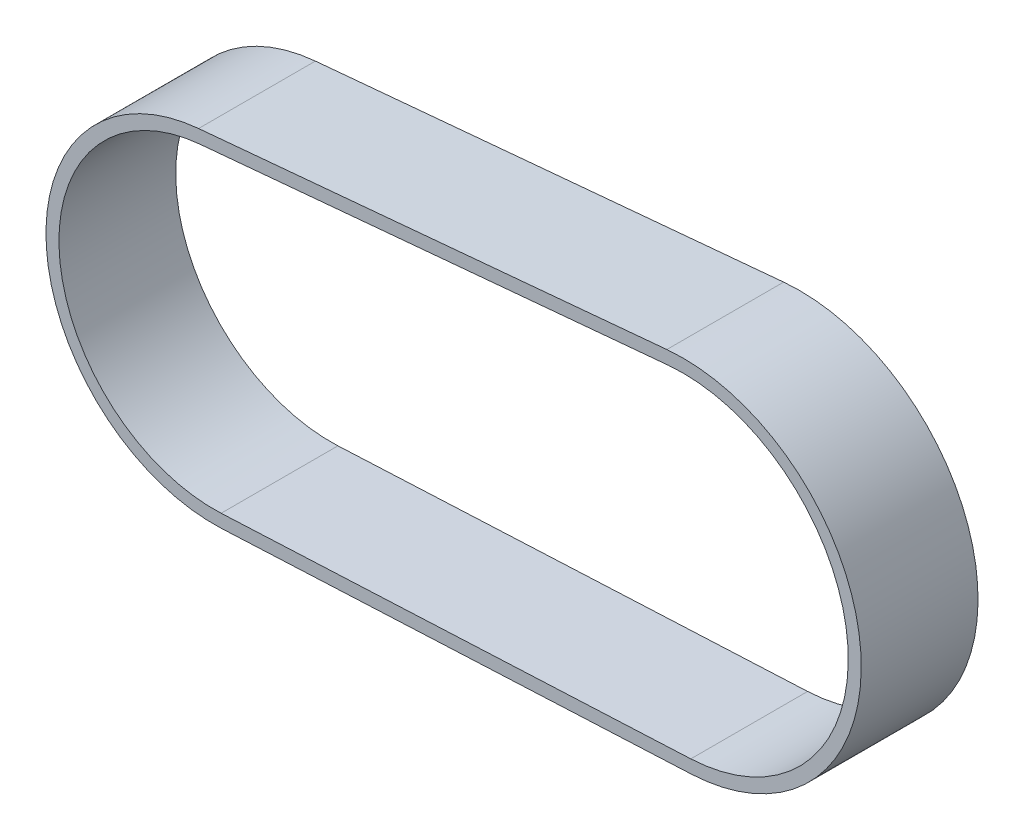
ISO-10303-21;
HEADER;
FILE_DESCRIPTION(('STEP AP214'),'2;1');
FILE_NAME('part.step','',(''),(''),'','','');
FILE_SCHEMA(('AUTOMOTIVE_DESIGN { 1 0 10303 214 1 1 1 1 }'));
ENDSEC;
DATA;
#1=APPLICATION_CONTEXT('core data for automotive mechanical design processes');
#2=APPLICATION_PROTOCOL_DEFINITION('international standard','automotive_design',2000,#1);
#3=PRODUCT_CONTEXT('',#1,'mechanical');
#4=PRODUCT('Part','Part','',(#3));
#5=PRODUCT_RELATED_PRODUCT_CATEGORY('part','',(#4));
#6=PRODUCT_DEFINITION_FORMATION('','',#4);
#7=PRODUCT_DEFINITION_CONTEXT('part definition',#1,'design');
#8=PRODUCT_DEFINITION('design','',#6,#7);
#9=PRODUCT_DEFINITION_SHAPE('','',#8);
#10=(LENGTH_UNIT() NAMED_UNIT(*) SI_UNIT(.MILLI.,.METRE.));
#11=(NAMED_UNIT(*) PLANE_ANGLE_UNIT() SI_UNIT($,.RADIAN.));
#12=(NAMED_UNIT(*) SI_UNIT($,.STERADIAN.) SOLID_ANGLE_UNIT());
#13=UNCERTAINTY_MEASURE_WITH_UNIT(LENGTH_MEASURE(1.E-05),#10,'distance_accuracy_value','');
#14=(GEOMETRIC_REPRESENTATION_CONTEXT(3) GLOBAL_UNCERTAINTY_ASSIGNED_CONTEXT((#13)) GLOBAL_UNIT_ASSIGNED_CONTEXT((#10,
#11,#12)) REPRESENTATION_CONTEXT('',''));
#15=CARTESIAN_POINT('',(0.,0.,0.));
#16=DIRECTION('',(0.,0.,1.));
#17=DIRECTION('',(1.,0.,0.));
#18=AXIS2_PLACEMENT_3D('',#15,#16,#17);
#19=CARTESIAN_POINT('',(0.,0.,9.));
#20=DIRECTION('',(0.,0.,-1.));
#21=DIRECTION('',(-1.,0.,0.));
#22=AXIS2_PLACEMENT_3D('',#19,#20,#21);
#23=PLANE('',#22);
#24=CARTESIAN_POINT('',(0.,0.,9.));
#25=DIRECTION('',(0.,0.,-1.));
#26=DIRECTION('',(-1.,0.,0.));
#27=AXIS2_PLACEMENT_3D('',#24,#25,#26);
#28=CIRCLE('',#27,12.9366207318922);
#29=CARTESIAN_POINT('',(-1.17556242806746,12.8830978005501,9.));
#30=VERTEX_POINT('',#29);
#31=CARTESIAN_POINT('',(0.608798913903516,-12.9222877170899,9.));
#32=VERTEX_POINT('',#31);
#33=EDGE_CURVE('E162',#30,#32,#28,.F.);
#34=ORIENTED_EDGE('',*,*,#33,.T.);
#35=DIRECTION('',(0.998892058822831,0.0470601192166559,0.));
#36=VECTOR('',#35,1.);
#37=CARTESIAN_POINT('',(0.608798913903507,-12.9222877170899,9.));
#38=LINE('',#37,#36);
#39=CARTESIAN_POINT('',(36.8011806217975,-11.2171807609735,9.));
#40=VERTEX_POINT('',#39);
#41=EDGE_CURVE('E165',#32,#40,#38,.T.);
#42=ORIENTED_EDGE('',*,*,#41,.T.);
#43=CARTESIAN_POINT('',(36.1549324549148,2.50000000000083,9.));
#44=DIRECTION('',(0.,0.,-1.));
#45=DIRECTION('',(-1.,0.,0.));
#46=AXIS2_PLACEMENT_3D('',#43,#44,#45);
#47=CIRCLE('',#46,13.7323954473516);
#48=CARTESIAN_POINT('',(34.9070572586146,16.1755801418779,9.));
#49=VERTEX_POINT('',#48);
#50=EDGE_CURVE('E168',#40,#49,#47,.F.);
#51=ORIENTED_EDGE('',*,*,#50,.T.);
#52=DIRECTION('',(-0.995862680645021,-0.0908709045762923,0.));
#53=VECTOR('',#52,1.);
#54=CARTESIAN_POINT('',(-1.17556242806746,12.8830978005501,9.));
#55=LINE('',#54,#53);
#56=EDGE_CURVE('E170',#49,#30,#55,.T.);
#57=ORIENTED_EDGE('',*,*,#56,.T.);
#58=EDGE_LOOP('',(#34,#42,#51,#57));
#59=FACE_BOUND('',#58,.T.);
#60=CARTESIAN_POINT('',(0.,0.,9.));
#61=DIRECTION('',(0.,0.,1.));
#62=DIRECTION('',(-1.,0.,0.));
#63=AXIS2_PLACEMENT_3D('',#60,#61,#62);
#64=CIRCLE('',#63,11.9366207318922);
#65=CARTESIAN_POINT('',(-1.08469152349116,11.887235119905,9.));
#66=VERTEX_POINT('',#65);
#67=CARTESIAN_POINT('',(0.561738794686851,-11.923395658267,9.));
#68=VERTEX_POINT('',#67);
#69=EDGE_CURVE('E126',#66,#68,#64,.T.);
#70=ORIENTED_EDGE('',*,*,#69,.F.);
#71=DIRECTION('',(-0.995862680645021,-0.0908709045762923,0.));
#72=VECTOR('',#71,1.);
#73=CARTESIAN_POINT('',(-1.08469152349116,11.887235119905,9.));
#74=LINE('',#73,#72);
#75=CARTESIAN_POINT('',(34.9979281631909,15.1797174612329,9.));
#76=VERTEX_POINT('',#75);
#77=EDGE_CURVE('E148',#76,#66,#74,.T.);
#78=ORIENTED_EDGE('',*,*,#77,.F.);
#79=CARTESIAN_POINT('',(36.1549324549148,2.50000000000083,9.));
#80=DIRECTION('',(0.,0.,1.));
#81=DIRECTION('',(-1.,0.,0.));
#82=AXIS2_PLACEMENT_3D('',#79,#80,#81);
#83=CIRCLE('',#82,12.7323954473516);
#84=CARTESIAN_POINT('',(36.7541205025808,-10.2182887021507,9.));
#85=VERTEX_POINT('',#84);
#86=EDGE_CURVE('E146',#85,#76,#83,.T.);
#87=ORIENTED_EDGE('',*,*,#86,.F.);
#88=DIRECTION('',(0.998892058822831,0.0470601192166559,0.));
#89=VECTOR('',#88,1.);
#90=CARTESIAN_POINT('',(36.7541205025808,-10.2182887021507,9.));
#91=LINE('',#90,#89);
#92=EDGE_CURVE('E134',#68,#85,#91,.T.);
#93=ORIENTED_EDGE('',*,*,#92,.F.);
#94=EDGE_LOOP('',(#70,#78,#87,#93));
#95=FACE_BOUND('',#94,.T.);
#96=ADVANCED_FACE('F61',(#59,#95),#23,.F.);
#97=CARTESIAN_POINT('',(0.,0.,0.));
#98=DIRECTION('',(0.,0.,-1.));
#99=DIRECTION('',(-1.,0.,0.));
#100=AXIS2_PLACEMENT_3D('',#97,#98,#99);
#101=PLANE('',#100);
#102=CARTESIAN_POINT('',(0.,0.,0.));
#103=DIRECTION('',(0.,0.,-1.));
#104=DIRECTION('',(-1.,0.,0.));
#105=AXIS2_PLACEMENT_3D('',#102,#103,#104);
#106=CIRCLE('',#105,12.9366207318922);
#107=CARTESIAN_POINT('',(-1.17556242806746,12.8830978005501,0.));
#108=VERTEX_POINT('',#107);
#109=CARTESIAN_POINT('',(0.608798913903516,-12.9222877170899,0.));
#110=VERTEX_POINT('',#109);
#111=EDGE_CURVE('E142',#108,#110,#106,.F.);
#112=ORIENTED_EDGE('',*,*,#111,.F.);
#113=DIRECTION('',(-0.995862680645021,-0.0908709045762923,0.));
#114=VECTOR('',#113,1.);
#115=CARTESIAN_POINT('',(-1.17556242806746,12.8830978005501,0.));
#116=LINE('',#115,#114);
#117=CARTESIAN_POINT('',(34.9070572586146,16.1755801418779,0.));
#118=VERTEX_POINT('',#117);
#119=EDGE_CURVE('E166',#118,#108,#116,.T.);
#120=ORIENTED_EDGE('',*,*,#119,.F.);
#121=CARTESIAN_POINT('',(36.1549324549148,2.50000000000083,0.));
#122=DIRECTION('',(0.,0.,-1.));
#123=DIRECTION('',(-1.,0.,0.));
#124=AXIS2_PLACEMENT_3D('',#121,#122,#123);
#125=CIRCLE('',#124,13.7323954473516);
#126=CARTESIAN_POINT('',(36.8011806217975,-11.2171807609735,0.));
#127=VERTEX_POINT('',#126);
#128=EDGE_CURVE('E177',#127,#118,#125,.F.);
#129=ORIENTED_EDGE('',*,*,#128,.F.);
#130=DIRECTION('',(0.998892058822831,0.0470601192166559,0.));
#131=VECTOR('',#130,1.);
#132=CARTESIAN_POINT('',(0.608798913903507,-12.9222877170899,0.));
#133=LINE('',#132,#131);
#134=EDGE_CURVE('E175',#110,#127,#133,.T.);
#135=ORIENTED_EDGE('',*,*,#134,.F.);
#136=EDGE_LOOP('',(#112,#120,#129,#135));
#137=FACE_BOUND('',#136,.T.);
#138=DIRECTION('',(-0.995862680645021,-0.0908709045762923,0.));
#139=VECTOR('',#138,1.);
#140=CARTESIAN_POINT('',(-1.08469152349116,11.887235119905,0.));
#141=LINE('',#140,#139);
#142=CARTESIAN_POINT('',(34.9979281631909,15.1797174612329,0.));
#143=VERTEX_POINT('',#142);
#144=CARTESIAN_POINT('',(-1.08469152349116,11.887235119905,0.));
#145=VERTEX_POINT('',#144);
#146=EDGE_CURVE('E135',#143,#145,#141,.T.);
#147=ORIENTED_EDGE('',*,*,#146,.T.);
#148=CARTESIAN_POINT('',(0.,0.,0.));
#149=DIRECTION('',(0.,0.,1.));
#150=DIRECTION('',(-1.,0.,0.));
#151=AXIS2_PLACEMENT_3D('',#148,#149,#150);
#152=CIRCLE('',#151,11.9366207318922);
#153=CARTESIAN_POINT('',(0.561738794686851,-11.923395658267,0.));
#154=VERTEX_POINT('',#153);
#155=EDGE_CURVE('E84',#145,#154,#152,.T.);
#156=ORIENTED_EDGE('',*,*,#155,.T.);
#157=DIRECTION('',(0.998892058822831,0.0470601192166559,0.));
#158=VECTOR('',#157,1.);
#159=CARTESIAN_POINT('',(36.7541205025808,-10.2182887021507,0.));
#160=LINE('',#159,#158);
#161=CARTESIAN_POINT('',(36.7541205025808,-10.2182887021507,0.));
#162=VERTEX_POINT('',#161);
#163=EDGE_CURVE('E141',#154,#162,#160,.T.);
#164=ORIENTED_EDGE('',*,*,#163,.T.);
#165=CARTESIAN_POINT('',(36.1549324549148,2.50000000000083,0.));
#166=DIRECTION('',(0.,0.,1.));
#167=DIRECTION('',(-1.,0.,0.));
#168=AXIS2_PLACEMENT_3D('',#165,#166,#167);
#169=CIRCLE('',#168,12.7323954473516);
#170=EDGE_CURVE('E154',#162,#143,#169,.T.);
#171=ORIENTED_EDGE('',*,*,#170,.T.);
#172=EDGE_LOOP('',(#147,#156,#164,#171));
#173=FACE_BOUND('',#172,.T.);
#174=ADVANCED_FACE('F195',(#137,#173),#101,.T.);
#175=CARTESIAN_POINT('',(0.,0.,9.));
#176=DIRECTION('',(0.,0.,-1.));
#177=DIRECTION('',(-1.,0.,0.));
#178=AXIS2_PLACEMENT_3D('',#175,#176,#177);
#179=CYLINDRICAL_SURFACE('',#178,12.9366207318922);
#180=ORIENTED_EDGE('',*,*,#111,.T.);
#181=DIRECTION('',(0.,0.,-1.));
#182=VECTOR('',#181,1.);
#183=CARTESIAN_POINT('',(0.608798913903516,-12.9222877170899,9.));
#184=LINE('',#183,#182);
#185=EDGE_CURVE('E12',#32,#110,#184,.T.);
#186=ORIENTED_EDGE('',*,*,#185,.F.);
#187=ORIENTED_EDGE('',*,*,#33,.F.);
#188=DIRECTION('',(0.,0.,-1.));
#189=VECTOR('',#188,1.);
#190=CARTESIAN_POINT('',(-1.17556242806746,12.8830978005501,9.));
#191=LINE('',#190,#189);
#192=EDGE_CURVE('E172',#30,#108,#191,.T.);
#193=ORIENTED_EDGE('',*,*,#192,.T.);
#194=EDGE_LOOP('',(#180,#186,#187,#193));
#195=FACE_BOUND('',#194,.T.);
#196=ADVANCED_FACE('F63',(#195),#179,.T.);
#197=CARTESIAN_POINT('',(0.608798913903507,-12.9222877170899,9.));
#198=DIRECTION('',(-0.0470601192166559,0.998892058822831,0.));
#199=DIRECTION('',(-0.998892058822831,-0.0470601192166559,0.));
#200=AXIS2_PLACEMENT_3D('',#197,#198,#199);
#201=PLANE('',#200);
#202=ORIENTED_EDGE('',*,*,#134,.T.);
#203=DIRECTION('',(0.,0.,-1.));
#204=VECTOR('',#203,1.);
#205=CARTESIAN_POINT('',(36.8011806217975,-11.2171807609735,9.));
#206=LINE('',#205,#204);
#207=EDGE_CURVE('E69',#40,#127,#206,.T.);
#208=ORIENTED_EDGE('',*,*,#207,.F.);
#209=ORIENTED_EDGE('',*,*,#41,.F.);
#210=ORIENTED_EDGE('',*,*,#185,.T.);
#211=EDGE_LOOP('',(#202,#208,#209,#210));
#212=FACE_BOUND('',#211,.T.);
#213=ADVANCED_FACE('F205',(#212),#201,.F.);
#214=CARTESIAN_POINT('',(36.1549324549148,2.50000000000083,9.));
#215=DIRECTION('',(0.,0.,-1.));
#216=DIRECTION('',(-1.,0.,0.));
#217=AXIS2_PLACEMENT_3D('',#214,#215,#216);
#218=CYLINDRICAL_SURFACE('',#217,13.7323954473516);
#219=ORIENTED_EDGE('',*,*,#128,.T.);
#220=DIRECTION('',(0.,0.,-1.));
#221=VECTOR('',#220,1.);
#222=CARTESIAN_POINT('',(34.9070572586146,16.1755801418779,9.));
#223=LINE('',#222,#221);
#224=EDGE_CURVE('E182',#49,#118,#223,.T.);
#225=ORIENTED_EDGE('',*,*,#224,.F.);
#226=ORIENTED_EDGE('',*,*,#50,.F.);
#227=ORIENTED_EDGE('',*,*,#207,.T.);
#228=EDGE_LOOP('',(#219,#225,#226,#227));
#229=FACE_BOUND('',#228,.T.);
#230=ADVANCED_FACE('F189',(#229),#218,.T.);
#231=CARTESIAN_POINT('',(-1.17556242806746,12.8830978005501,9.));
#232=DIRECTION('',(0.0908709045762923,-0.995862680645021,0.));
#233=DIRECTION('',(0.995862680645021,0.0908709045762923,0.));
#234=AXIS2_PLACEMENT_3D('',#231,#232,#233);
#235=PLANE('',#234);
#236=ORIENTED_EDGE('',*,*,#119,.T.);
#237=ORIENTED_EDGE('',*,*,#192,.F.);
#238=ORIENTED_EDGE('',*,*,#56,.F.);
#239=ORIENTED_EDGE('',*,*,#224,.T.);
#240=EDGE_LOOP('',(#236,#237,#238,#239));
#241=FACE_BOUND('',#240,.T.);
#242=ADVANCED_FACE('F199',(#241),#235,.F.);
#243=CARTESIAN_POINT('',(0.,0.,9.));
#244=DIRECTION('',(0.,0.,-1.));
#245=DIRECTION('',(-1.,0.,0.));
#246=AXIS2_PLACEMENT_3D('',#243,#244,#245);
#247=CYLINDRICAL_SURFACE('',#246,11.9366207318922);
#248=ORIENTED_EDGE('',*,*,#155,.F.);
#249=DIRECTION('',(0.,0.,-1.));
#250=VECTOR('',#249,1.);
#251=CARTESIAN_POINT('',(-1.08469152349116,11.887235119905,9.));
#252=LINE('',#251,#250);
#253=EDGE_CURVE('E130',#66,#145,#252,.T.);
#254=ORIENTED_EDGE('',*,*,#253,.F.);
#255=ORIENTED_EDGE('',*,*,#69,.T.);
#256=DIRECTION('',(0.,0.,-1.));
#257=VECTOR('',#256,1.);
#258=CARTESIAN_POINT('',(0.561738794686851,-11.923395658267,9.));
#259=LINE('',#258,#257);
#260=EDGE_CURVE('E129',#68,#154,#259,.T.);
#261=ORIENTED_EDGE('',*,*,#260,.T.);
#262=EDGE_LOOP('',(#248,#254,#255,#261));
#263=FACE_BOUND('',#262,.T.);
#264=ADVANCED_FACE('F128',(#263),#247,.F.);
#265=CARTESIAN_POINT('',(36.7541205025808,-10.2182887021507,9.));
#266=DIRECTION('',(-0.0470601192166559,0.998892058822831,0.));
#267=DIRECTION('',(-0.998892058822831,-0.0470601192166559,0.));
#268=AXIS2_PLACEMENT_3D('',#265,#266,#267);
#269=PLANE('',#268);
#270=ORIENTED_EDGE('',*,*,#163,.F.);
#271=ORIENTED_EDGE('',*,*,#260,.F.);
#272=ORIENTED_EDGE('',*,*,#92,.T.);
#273=DIRECTION('',(0.,0.,-1.));
#274=VECTOR('',#273,1.);
#275=CARTESIAN_POINT('',(36.7541205025808,-10.2182887021507,9.));
#276=LINE('',#275,#274);
#277=EDGE_CURVE('E143',#85,#162,#276,.T.);
#278=ORIENTED_EDGE('',*,*,#277,.T.);
#279=EDGE_LOOP('',(#270,#271,#272,#278));
#280=FACE_BOUND('',#279,.T.);
#281=ADVANCED_FACE('F138',(#280),#269,.T.);
#282=CARTESIAN_POINT('',(36.1549324549148,2.50000000000083,9.));
#283=DIRECTION('',(0.,0.,-1.));
#284=DIRECTION('',(-1.,0.,0.));
#285=AXIS2_PLACEMENT_3D('',#282,#283,#284);
#286=CYLINDRICAL_SURFACE('',#285,12.7323954473516);
#287=ORIENTED_EDGE('',*,*,#170,.F.);
#288=ORIENTED_EDGE('',*,*,#277,.F.);
#289=ORIENTED_EDGE('',*,*,#86,.T.);
#290=DIRECTION('',(0.,0.,-1.));
#291=VECTOR('',#290,1.);
#292=CARTESIAN_POINT('',(34.9979281631909,15.1797174612329,9.));
#293=LINE('',#292,#291);
#294=EDGE_CURVE('E76',#76,#143,#293,.T.);
#295=ORIENTED_EDGE('',*,*,#294,.T.);
#296=EDGE_LOOP('',(#287,#288,#289,#295));
#297=FACE_BOUND('',#296,.T.);
#298=ADVANCED_FACE('F228',(#297),#286,.F.);
#299=CARTESIAN_POINT('',(-1.08469152349116,11.887235119905,9.));
#300=DIRECTION('',(0.0908709045762923,-0.995862680645021,0.));
#301=DIRECTION('',(0.995862680645021,0.0908709045762923,0.));
#302=AXIS2_PLACEMENT_3D('',#299,#300,#301);
#303=PLANE('',#302);
#304=ORIENTED_EDGE('',*,*,#146,.F.);
#305=ORIENTED_EDGE('',*,*,#294,.F.);
#306=ORIENTED_EDGE('',*,*,#77,.T.);
#307=ORIENTED_EDGE('',*,*,#253,.T.);
#308=EDGE_LOOP('',(#304,#305,#306,#307));
#309=FACE_BOUND('',#308,.T.);
#310=ADVANCED_FACE('F232',(#309),#303,.T.);
#311=CLOSED_SHELL('',(#96,#174,#196,#213,#230,#242,#264,#281,#298,#310));
#312=MANIFOLD_SOLID_BREP('B2',#311);
#313=ADVANCED_BREP_SHAPE_REPRESENTATION('',(#18,#312),#14);
#314=SHAPE_DEFINITION_REPRESENTATION(#9,#313);
ENDSEC;
END-ISO-10303-21;
